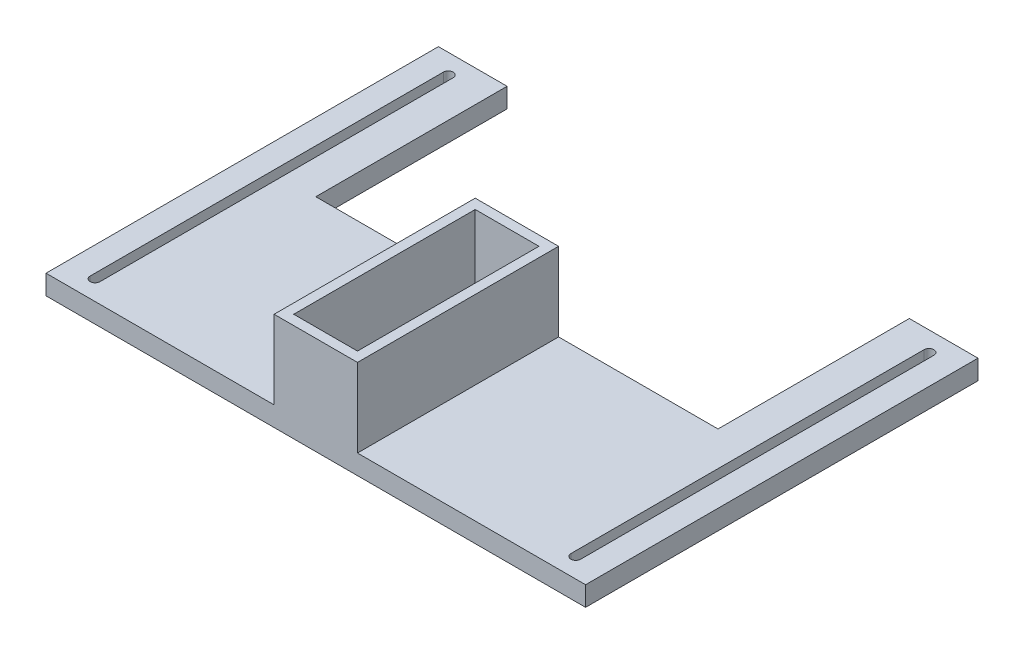
ISO-10303-21;
HEADER;
FILE_DESCRIPTION(('STEP AP214'),'2;1');
FILE_NAME('part.step','',(''),(''),'','','');
FILE_SCHEMA(('AUTOMOTIVE_DESIGN { 1 0 10303 214 1 1 1 1 }'));
ENDSEC;
DATA;
#1=APPLICATION_CONTEXT('core data for automotive mechanical design processes');
#2=APPLICATION_PROTOCOL_DEFINITION('international standard','automotive_design',2000,#1);
#3=PRODUCT_CONTEXT('',#1,'mechanical');
#4=PRODUCT('Part','Part','',(#3));
#5=PRODUCT_RELATED_PRODUCT_CATEGORY('part','',(#4));
#6=PRODUCT_DEFINITION_FORMATION('','',#4);
#7=PRODUCT_DEFINITION_CONTEXT('part definition',#1,'design');
#8=PRODUCT_DEFINITION('design','',#6,#7);
#9=PRODUCT_DEFINITION_SHAPE('','',#8);
#10=(LENGTH_UNIT() NAMED_UNIT(*) SI_UNIT(.MILLI.,.METRE.));
#11=(NAMED_UNIT(*) PLANE_ANGLE_UNIT() SI_UNIT($,.RADIAN.));
#12=(NAMED_UNIT(*) SI_UNIT($,.STERADIAN.) SOLID_ANGLE_UNIT());
#13=UNCERTAINTY_MEASURE_WITH_UNIT(LENGTH_MEASURE(1.E-05),#10,'distance_accuracy_value','');
#14=(GEOMETRIC_REPRESENTATION_CONTEXT(3) GLOBAL_UNCERTAINTY_ASSIGNED_CONTEXT((#13)) GLOBAL_UNIT_ASSIGNED_CONTEXT((#10,
#11,#12)) REPRESENTATION_CONTEXT('',''));
#15=CARTESIAN_POINT('',(0.,0.,0.));
#16=DIRECTION('',(0.,0.,1.));
#17=DIRECTION('',(1.,0.,0.));
#18=AXIS2_PLACEMENT_3D('',#15,#16,#17);
#19=CARTESIAN_POINT('',(0.,0.,0.));
#20=DIRECTION('',(0.,1.,0.));
#21=DIRECTION('',(0.,0.,1.));
#22=AXIS2_PLACEMENT_3D('',#19,#20,#21);
#23=PLANE('',#22);
#24=DIRECTION('',(0.,0.,-1.));
#25=VECTOR('',#24,1.);
#26=CARTESIAN_POINT('',(4.25,0.,0.));
#27=LINE('',#26,#25);
#28=CARTESIAN_POINT('',(4.25,0.,10.25));
#29=VERTEX_POINT('',#28);
#30=CARTESIAN_POINT('',(4.25000000000001,0.,-10.25));
#31=VERTEX_POINT('',#30);
#32=EDGE_CURVE('E382',#29,#31,#27,.T.);
#33=ORIENTED_EDGE('',*,*,#32,.F.);
#34=DIRECTION('',(-1.,0.,0.));
#35=VECTOR('',#34,1.);
#36=CARTESIAN_POINT('',(-27.5,0.,10.25));
#37=LINE('',#36,#35);
#38=CARTESIAN_POINT('',(27.5,0.,10.25));
#39=VERTEX_POINT('',#38);
#40=EDGE_CURVE('E325',#39,#29,#37,.T.);
#41=ORIENTED_EDGE('',*,*,#40,.F.);
#42=DIRECTION('',(0.,0.,1.));
#43=VECTOR('',#42,1.);
#44=CARTESIAN_POINT('',(27.5,0.,10.25));
#45=LINE('',#44,#43);
#46=CARTESIAN_POINT('',(27.5,0.,-29.75));
#47=VERTEX_POINT('',#46);
#48=EDGE_CURVE('E322',#47,#39,#45,.T.);
#49=ORIENTED_EDGE('',*,*,#48,.F.);
#50=DIRECTION('',(1.,0.,0.));
#51=VECTOR('',#50,1.);
#52=CARTESIAN_POINT('',(27.5,0.,-29.75));
#53=LINE('',#52,#51);
#54=CARTESIAN_POINT('',(20.5,0.,-29.75));
#55=VERTEX_POINT('',#54);
#56=EDGE_CURVE('E320',#55,#47,#53,.T.);
#57=ORIENTED_EDGE('',*,*,#56,.F.);
#58=DIRECTION('',(0.,0.,-1.));
#59=VECTOR('',#58,1.);
#60=CARTESIAN_POINT('',(20.5,0.,-29.75));
#61=LINE('',#60,#59);
#62=CARTESIAN_POINT('',(20.5,0.,-10.25));
#63=VERTEX_POINT('',#62);
#64=EDGE_CURVE('E318',#63,#55,#61,.T.);
#65=ORIENTED_EDGE('',*,*,#64,.F.);
#66=DIRECTION('',(1.,0.,0.));
#67=VECTOR('',#66,1.);
#68=CARTESIAN_POINT('',(20.5,0.,-10.25));
#69=LINE('',#68,#67);
#70=EDGE_CURVE('E314',#31,#63,#69,.T.);
#71=ORIENTED_EDGE('',*,*,#70,.F.);
#72=EDGE_LOOP('',(#33,#41,#49,#57,#65,#71));
#73=FACE_BOUND('',#72,.T.);
#74=DIRECTION('',(0.,0.,-1.));
#75=VECTOR('',#74,1.);
#76=CARTESIAN_POINT('',(25.,0.,8.24999999999999));
#77=LINE('',#76,#75);
#78=CARTESIAN_POINT('',(25.,0.,8.24999999999999));
#79=VERTEX_POINT('',#78);
#80=CARTESIAN_POINT('',(25.,0.,-27.75));
#81=VERTEX_POINT('',#80);
#82=EDGE_CURVE('E242',#79,#81,#77,.T.);
#83=ORIENTED_EDGE('',*,*,#82,.F.);
#84=CARTESIAN_POINT('',(24.5,0.,8.24999999999999));
#85=DIRECTION('',(0.,1.,0.));
#86=DIRECTION('',(0.,0.,1.));
#87=AXIS2_PLACEMENT_3D('',#84,#85,#86);
#88=CIRCLE('',#87,0.500000000000002);
#89=CARTESIAN_POINT('',(24.,0.,8.24999999999999));
#90=VERTEX_POINT('',#89);
#91=EDGE_CURVE('E226',#90,#79,#88,.T.);
#92=ORIENTED_EDGE('',*,*,#91,.F.);
#93=DIRECTION('',(0.,0.,1.));
#94=VECTOR('',#93,1.);
#95=CARTESIAN_POINT('',(24.,0.,8.24999999999999));
#96=LINE('',#95,#94);
#97=CARTESIAN_POINT('',(24.,0.,-27.75));
#98=VERTEX_POINT('',#97);
#99=EDGE_CURVE('E235',#98,#90,#96,.T.);
#100=ORIENTED_EDGE('',*,*,#99,.F.);
#101=CARTESIAN_POINT('',(24.5,0.,-27.75));
#102=DIRECTION('',(0.,1.,0.));
#103=DIRECTION('',(0.,0.,1.));
#104=AXIS2_PLACEMENT_3D('',#101,#102,#103);
#105=CIRCLE('',#104,0.5);
#106=EDGE_CURVE('E78',#81,#98,#105,.T.);
#107=ORIENTED_EDGE('',*,*,#106,.F.);
#108=EDGE_LOOP('',(#83,#92,#100,#107));
#109=FACE_BOUND('',#108,.T.);
#110=ADVANCED_FACE('F63',(#73,#109),#23,.T.);
#111=CARTESIAN_POINT('',(0.,-2.,0.));
#112=DIRECTION('',(0.,1.,0.));
#113=DIRECTION('',(0.,0.,1.));
#114=AXIS2_PLACEMENT_3D('',#111,#112,#113);
#115=PLANE('',#114);
#116=DIRECTION('',(1.,0.,0.));
#117=VECTOR('',#116,1.);
#118=CARTESIAN_POINT('',(-20.5,-2.,-29.75));
#119=LINE('',#118,#117);
#120=CARTESIAN_POINT('',(-27.5,-2.,-29.75));
#121=VERTEX_POINT('',#120);
#122=CARTESIAN_POINT('',(-20.5,-2.,-29.75));
#123=VERTEX_POINT('',#122);
#124=EDGE_CURVE('E291',#121,#123,#119,.T.);
#125=ORIENTED_EDGE('',*,*,#124,.T.);
#126=DIRECTION('',(0.,0.,1.));
#127=VECTOR('',#126,1.);
#128=CARTESIAN_POINT('',(-20.5,-2.,-10.25));
#129=LINE('',#128,#127);
#130=CARTESIAN_POINT('',(-20.5,-2.,-10.25));
#131=VERTEX_POINT('',#130);
#132=EDGE_CURVE('E294',#123,#131,#129,.T.);
#133=ORIENTED_EDGE('',*,*,#132,.T.);
#134=DIRECTION('',(1.,0.,0.));
#135=VECTOR('',#134,1.);
#136=CARTESIAN_POINT('',(20.5,-2.,-10.25));
#137=LINE('',#136,#135);
#138=CARTESIAN_POINT('',(20.5,-2.,-10.25));
#139=VERTEX_POINT('',#138);
#140=EDGE_CURVE('E297',#131,#139,#137,.T.);
#141=ORIENTED_EDGE('',*,*,#140,.T.);
#142=DIRECTION('',(0.,0.,-1.));
#143=VECTOR('',#142,1.);
#144=CARTESIAN_POINT('',(20.5,-2.,-29.75));
#145=LINE('',#144,#143);
#146=CARTESIAN_POINT('',(20.5,-2.,-29.75));
#147=VERTEX_POINT('',#146);
#148=EDGE_CURVE('E299',#139,#147,#145,.T.);
#149=ORIENTED_EDGE('',*,*,#148,.T.);
#150=DIRECTION('',(1.,0.,0.));
#151=VECTOR('',#150,1.);
#152=CARTESIAN_POINT('',(27.5,-2.,-29.75));
#153=LINE('',#152,#151);
#154=CARTESIAN_POINT('',(27.5,-2.,-29.75));
#155=VERTEX_POINT('',#154);
#156=EDGE_CURVE('E301',#147,#155,#153,.T.);
#157=ORIENTED_EDGE('',*,*,#156,.T.);
#158=DIRECTION('',(0.,0.,1.));
#159=VECTOR('',#158,1.);
#160=CARTESIAN_POINT('',(27.5,-2.,10.25));
#161=LINE('',#160,#159);
#162=CARTESIAN_POINT('',(27.5,-2.,10.25));
#163=VERTEX_POINT('',#162);
#164=EDGE_CURVE('E303',#155,#163,#161,.T.);
#165=ORIENTED_EDGE('',*,*,#164,.T.);
#166=DIRECTION('',(-1.,0.,0.));
#167=VECTOR('',#166,1.);
#168=CARTESIAN_POINT('',(-27.5,-2.,10.25));
#169=LINE('',#168,#167);
#170=CARTESIAN_POINT('',(-27.5,-2.,10.25));
#171=VERTEX_POINT('',#170);
#172=EDGE_CURVE('E305',#163,#171,#169,.T.);
#173=ORIENTED_EDGE('',*,*,#172,.T.);
#174=DIRECTION('',(0.,0.,-1.));
#175=VECTOR('',#174,1.);
#176=CARTESIAN_POINT('',(-27.5,-2.,-29.75));
#177=LINE('',#176,#175);
#178=EDGE_CURVE('E307',#171,#121,#177,.T.);
#179=ORIENTED_EDGE('',*,*,#178,.T.);
#180=EDGE_LOOP('',(#125,#133,#141,#149,#157,#165,#173,#179));
#181=FACE_BOUND('',#180,.T.);
#182=DIRECTION('',(0.,0.,-1.));
#183=VECTOR('',#182,1.);
#184=CARTESIAN_POINT('',(-25.,-2.,8.24999999999999));
#185=LINE('',#184,#183);
#186=CARTESIAN_POINT('',(-25.,-2.,8.24999999999999));
#187=VERTEX_POINT('',#186);
#188=CARTESIAN_POINT('',(-25.,-2.,-27.75));
#189=VERTEX_POINT('',#188);
#190=EDGE_CURVE('E269',#187,#189,#185,.T.);
#191=ORIENTED_EDGE('',*,*,#190,.F.);
#192=CARTESIAN_POINT('',(-24.5,-2.,8.24999999999999));
#193=DIRECTION('',(0.,-1.,0.));
#194=DIRECTION('',(0.,0.,-1.));
#195=AXIS2_PLACEMENT_3D('',#192,#193,#194);
#196=CIRCLE('',#195,0.500000000000002);
#197=CARTESIAN_POINT('',(-24.,-2.,8.24999999999999));
#198=VERTEX_POINT('',#197);
#199=EDGE_CURVE('E267',#198,#187,#196,.T.);
#200=ORIENTED_EDGE('',*,*,#199,.F.);
#201=DIRECTION('',(0.,0.,1.));
#202=VECTOR('',#201,1.);
#203=CARTESIAN_POINT('',(-24.,-2.,8.24999999999999));
#204=LINE('',#203,#202);
#205=CARTESIAN_POINT('',(-24.,-2.,-27.75));
#206=VERTEX_POINT('',#205);
#207=EDGE_CURVE('E275',#206,#198,#204,.T.);
#208=ORIENTED_EDGE('',*,*,#207,.F.);
#209=CARTESIAN_POINT('',(-24.5,-2.,-27.75));
#210=DIRECTION('',(0.,-1.,0.));
#211=DIRECTION('',(0.,0.,-1.));
#212=AXIS2_PLACEMENT_3D('',#209,#210,#211);
#213=CIRCLE('',#212,0.5);
#214=EDGE_CURVE('E272',#189,#206,#213,.T.);
#215=ORIENTED_EDGE('',*,*,#214,.F.);
#216=EDGE_LOOP('',(#191,#200,#208,#215));
#217=FACE_BOUND('',#216,.T.);
#218=CARTESIAN_POINT('',(24.5,-2.,8.24999999999999));
#219=DIRECTION('',(0.,1.,0.));
#220=DIRECTION('',(0.,0.,-1.));
#221=AXIS2_PLACEMENT_3D('',#218,#219,#220);
#222=CIRCLE('',#221,0.500000000000002);
#223=CARTESIAN_POINT('',(24.,-2.,8.24999999999999));
#224=VERTEX_POINT('',#223);
#225=CARTESIAN_POINT('',(25.,-2.,8.24999999999999));
#226=VERTEX_POINT('',#225);
#227=EDGE_CURVE('E86',#224,#226,#222,.T.);
#228=ORIENTED_EDGE('',*,*,#227,.T.);
#229=DIRECTION('',(0.,0.,-1.));
#230=VECTOR('',#229,1.);
#231=CARTESIAN_POINT('',(25.,-2.,8.24999999999999));
#232=LINE('',#231,#230);
#233=CARTESIAN_POINT('',(25.,-2.,-27.75));
#234=VERTEX_POINT('',#233);
#235=EDGE_CURVE('E232',#226,#234,#232,.T.);
#236=ORIENTED_EDGE('',*,*,#235,.T.);
#237=CARTESIAN_POINT('',(24.5,-2.,-27.75));
#238=DIRECTION('',(0.,1.,0.));
#239=DIRECTION('',(0.,0.,-1.));
#240=AXIS2_PLACEMENT_3D('',#237,#238,#239);
#241=CIRCLE('',#240,0.5);
#242=CARTESIAN_POINT('',(24.,-2.,-27.75));
#243=VERTEX_POINT('',#242);
#244=EDGE_CURVE('E250',#234,#243,#241,.T.);
#245=ORIENTED_EDGE('',*,*,#244,.T.);
#246=DIRECTION('',(0.,0.,1.));
#247=VECTOR('',#246,1.);
#248=CARTESIAN_POINT('',(24.,-2.,8.24999999999999));
#249=LINE('',#248,#247);
#250=EDGE_CURVE('E244',#243,#224,#249,.T.);
#251=ORIENTED_EDGE('',*,*,#250,.T.);
#252=EDGE_LOOP('',(#228,#236,#245,#251));
#253=FACE_BOUND('',#252,.T.);
#254=ADVANCED_FACE('F428',(#181,#217,#253),#115,.F.);
#255=CARTESIAN_POINT('',(0.,8.,0.));
#256=DIRECTION('',(0.,1.,0.));
#257=DIRECTION('',(0.,0.,1.));
#258=AXIS2_PLACEMENT_3D('',#255,#256,#257);
#259=PLANE('',#258);
#260=DIRECTION('',(0.,0.,-1.));
#261=VECTOR('',#260,1.);
#262=CARTESIAN_POINT('',(4.25,8.,0.));
#263=LINE('',#262,#261);
#264=CARTESIAN_POINT('',(4.25,8.,10.25));
#265=VERTEX_POINT('',#264);
#266=CARTESIAN_POINT('',(4.25,8.,-10.25));
#267=VERTEX_POINT('',#266);
#268=EDGE_CURVE('E383',#265,#267,#263,.T.);
#269=ORIENTED_EDGE('',*,*,#268,.T.);
#270=DIRECTION('',(-1.,0.,0.));
#271=VECTOR('',#270,1.);
#272=CARTESIAN_POINT('',(0.,8.,-10.25));
#273=LINE('',#272,#271);
#274=CARTESIAN_POINT('',(-4.25,8.,-10.25));
#275=VERTEX_POINT('',#274);
#276=EDGE_CURVE('E386',#267,#275,#273,.T.);
#277=ORIENTED_EDGE('',*,*,#276,.T.);
#278=DIRECTION('',(0.,0.,1.));
#279=VECTOR('',#278,1.);
#280=CARTESIAN_POINT('',(-4.25,8.,0.));
#281=LINE('',#280,#279);
#282=CARTESIAN_POINT('',(-4.25,8.,10.25));
#283=VERTEX_POINT('',#282);
#284=EDGE_CURVE('E389',#275,#283,#281,.T.);
#285=ORIENTED_EDGE('',*,*,#284,.T.);
#286=DIRECTION('',(1.,0.,0.));
#287=VECTOR('',#286,1.);
#288=CARTESIAN_POINT('',(0.,8.,10.25));
#289=LINE('',#288,#287);
#290=EDGE_CURVE('E391',#283,#265,#289,.T.);
#291=ORIENTED_EDGE('',*,*,#290,.T.);
#292=EDGE_LOOP('',(#269,#277,#285,#291));
#293=FACE_BOUND('',#292,.T.);
#294=DIRECTION('',(-1.,0.,0.));
#295=VECTOR('',#294,1.);
#296=CARTESIAN_POINT('',(-3.25,8.,-9.25));
#297=LINE('',#296,#295);
#298=CARTESIAN_POINT('',(3.25,8.,-9.25));
#299=VERTEX_POINT('',#298);
#300=CARTESIAN_POINT('',(-3.25,8.,-9.25));
#301=VERTEX_POINT('',#300);
#302=EDGE_CURVE('E355',#299,#301,#297,.T.);
#303=ORIENTED_EDGE('',*,*,#302,.F.);
#304=DIRECTION('',(0.,0.,-1.));
#305=VECTOR('',#304,1.);
#306=CARTESIAN_POINT('',(3.25,8.,9.25));
#307=LINE('',#306,#305);
#308=CARTESIAN_POINT('',(3.25,8.,9.25));
#309=VERTEX_POINT('',#308);
#310=EDGE_CURVE('E353',#309,#299,#307,.T.);
#311=ORIENTED_EDGE('',*,*,#310,.F.);
#312=DIRECTION('',(1.,0.,0.));
#313=VECTOR('',#312,1.);
#314=CARTESIAN_POINT('',(-3.25,8.,9.25));
#315=LINE('',#314,#313);
#316=CARTESIAN_POINT('',(-3.25,8.,9.25));
#317=VERTEX_POINT('',#316);
#318=EDGE_CURVE('E361',#317,#309,#315,.T.);
#319=ORIENTED_EDGE('',*,*,#318,.F.);
#320=DIRECTION('',(0.,0.,1.));
#321=VECTOR('',#320,1.);
#322=CARTESIAN_POINT('',(-3.25,8.,9.25));
#323=LINE('',#322,#321);
#324=EDGE_CURVE('E358',#301,#317,#323,.T.);
#325=ORIENTED_EDGE('',*,*,#324,.F.);
#326=EDGE_LOOP('',(#303,#311,#319,#325));
#327=FACE_BOUND('',#326,.T.);
#328=ADVANCED_FACE('F444',(#293,#327),#259,.T.);
#329=CARTESIAN_POINT('',(4.25,8.,0.));
#330=DIRECTION('',(-1.,0.,0.));
#331=DIRECTION('',(0.,0.,1.));
#332=AXIS2_PLACEMENT_3D('',#329,#330,#331);
#333=PLANE('',#332);
#334=ORIENTED_EDGE('',*,*,#32,.T.);
#335=DIRECTION('',(0.,-1.,0.));
#336=VECTOR('',#335,1.);
#337=CARTESIAN_POINT('',(4.25,8.,-10.25));
#338=LINE('',#337,#336);
#339=EDGE_CURVE('E12',#267,#31,#338,.T.);
#340=ORIENTED_EDGE('',*,*,#339,.F.);
#341=ORIENTED_EDGE('',*,*,#268,.F.);
#342=DIRECTION('',(0.,-1.,0.));
#343=VECTOR('',#342,1.);
#344=CARTESIAN_POINT('',(4.25,8.,10.25));
#345=LINE('',#344,#343);
#346=EDGE_CURVE('E393',#265,#29,#345,.T.);
#347=ORIENTED_EDGE('',*,*,#346,.T.);
#348=EDGE_LOOP('',(#334,#340,#341,#347));
#349=FACE_BOUND('',#348,.T.);
#350=ADVANCED_FACE('F65',(#349),#333,.F.);
#351=CARTESIAN_POINT('',(0.,8.,-10.25));
#352=DIRECTION('',(0.,0.,1.));
#353=DIRECTION('',(1.,0.,0.));
#354=AXIS2_PLACEMENT_3D('',#351,#352,#353);
#355=PLANE('',#354);
#356=ORIENTED_EDGE('',*,*,#339,.T.);
#357=ORIENTED_EDGE('',*,*,#70,.T.);
#358=DIRECTION('',(0.,1.,0.));
#359=VECTOR('',#358,1.);
#360=CARTESIAN_POINT('',(20.5,-2.,-10.25));
#361=LINE('',#360,#359);
#362=EDGE_CURVE('E343',#139,#63,#361,.T.);
#363=ORIENTED_EDGE('',*,*,#362,.F.);
#364=ORIENTED_EDGE('',*,*,#140,.F.);
#365=DIRECTION('',(0.,1.,0.));
#366=VECTOR('',#365,1.);
#367=CARTESIAN_POINT('',(-20.5,-2.,-10.25));
#368=LINE('',#367,#366);
#369=CARTESIAN_POINT('',(-20.5,0.,-10.25));
#370=VERTEX_POINT('',#369);
#371=EDGE_CURVE('E346',#131,#370,#368,.T.);
#372=ORIENTED_EDGE('',*,*,#371,.T.);
#373=CARTESIAN_POINT('',(-4.24999999999999,0.,-10.25));
#374=VERTEX_POINT('',#373);
#375=EDGE_CURVE('E315',#370,#374,#69,.T.);
#376=ORIENTED_EDGE('',*,*,#375,.T.);
#377=DIRECTION('',(0.,-1.,0.));
#378=VECTOR('',#377,1.);
#379=CARTESIAN_POINT('',(-4.25,8.,-10.25));
#380=LINE('',#379,#378);
#381=EDGE_CURVE('E71',#275,#374,#380,.T.);
#382=ORIENTED_EDGE('',*,*,#381,.F.);
#383=ORIENTED_EDGE('',*,*,#276,.F.);
#384=EDGE_LOOP('',(#356,#357,#363,#364,#372,#376,#382,#383));
#385=FACE_BOUND('',#384,.T.);
#386=ADVANCED_FACE('F409',(#385),#355,.F.);
#387=CARTESIAN_POINT('',(-4.25,8.,0.));
#388=DIRECTION('',(1.,0.,0.));
#389=DIRECTION('',(0.,0.,-1.));
#390=AXIS2_PLACEMENT_3D('',#387,#388,#389);
#391=PLANE('',#390);
#392=DIRECTION('',(0.,0.,1.));
#393=VECTOR('',#392,1.);
#394=CARTESIAN_POINT('',(-4.25,0.,0.));
#395=LINE('',#394,#393);
#396=CARTESIAN_POINT('',(-4.25,0.,10.25));
#397=VERTEX_POINT('',#396);
#398=EDGE_CURVE('E387',#374,#397,#395,.T.);
#399=ORIENTED_EDGE('',*,*,#398,.T.);
#400=DIRECTION('',(0.,-1.,0.));
#401=VECTOR('',#400,1.);
#402=CARTESIAN_POINT('',(-4.25,8.,10.25));
#403=LINE('',#402,#401);
#404=EDGE_CURVE('E400',#283,#397,#403,.T.);
#405=ORIENTED_EDGE('',*,*,#404,.F.);
#406=ORIENTED_EDGE('',*,*,#284,.F.);
#407=ORIENTED_EDGE('',*,*,#381,.T.);
#408=EDGE_LOOP('',(#399,#405,#406,#407));
#409=FACE_BOUND('',#408,.T.);
#410=ADVANCED_FACE('F406',(#409),#391,.F.);
#411=CARTESIAN_POINT('',(0.,8.,10.25));
#412=DIRECTION('',(0.,0.,-1.));
#413=DIRECTION('',(-1.,0.,0.));
#414=AXIS2_PLACEMENT_3D('',#411,#412,#413);
#415=PLANE('',#414);
#416=ORIENTED_EDGE('',*,*,#404,.T.);
#417=CARTESIAN_POINT('',(-27.5,0.,10.25));
#418=VERTEX_POINT('',#417);
#419=EDGE_CURVE('E324',#397,#418,#37,.T.);
#420=ORIENTED_EDGE('',*,*,#419,.T.);
#421=DIRECTION('',(0.,1.,0.));
#422=VECTOR('',#421,1.);
#423=CARTESIAN_POINT('',(-27.5,-2.,10.25));
#424=LINE('',#423,#422);
#425=EDGE_CURVE('E331',#171,#418,#424,.T.);
#426=ORIENTED_EDGE('',*,*,#425,.F.);
#427=ORIENTED_EDGE('',*,*,#172,.F.);
#428=DIRECTION('',(0.,1.,0.));
#429=VECTOR('',#428,1.);
#430=CARTESIAN_POINT('',(27.5,-2.,10.25));
#431=LINE('',#430,#429);
#432=EDGE_CURVE('E334',#163,#39,#431,.T.);
#433=ORIENTED_EDGE('',*,*,#432,.T.);
#434=ORIENTED_EDGE('',*,*,#40,.T.);
#435=ORIENTED_EDGE('',*,*,#346,.F.);
#436=ORIENTED_EDGE('',*,*,#290,.F.);
#437=EDGE_LOOP('',(#416,#420,#426,#427,#433,#434,#435,#436));
#438=FACE_BOUND('',#437,.T.);
#439=ADVANCED_FACE('F419',(#438),#415,.F.);
#440=CARTESIAN_POINT('',(3.25,8.,9.25));
#441=DIRECTION('',(-1.,0.,0.));
#442=DIRECTION('',(0.,0.,1.));
#443=AXIS2_PLACEMENT_3D('',#440,#441,#442);
#444=PLANE('',#443);
#445=DIRECTION('',(0.,0.,-1.));
#446=VECTOR('',#445,1.);
#447=CARTESIAN_POINT('',(3.25,0.,9.25));
#448=LINE('',#447,#446);
#449=CARTESIAN_POINT('',(3.25,0.,9.25));
#450=VERTEX_POINT('',#449);
#451=CARTESIAN_POINT('',(3.25,0.,-9.25));
#452=VERTEX_POINT('',#451);
#453=EDGE_CURVE('E352',#450,#452,#448,.T.);
#454=ORIENTED_EDGE('',*,*,#453,.F.);
#455=DIRECTION('',(0.,-1.,0.));
#456=VECTOR('',#455,1.);
#457=CARTESIAN_POINT('',(3.25,8.,9.25));
#458=LINE('',#457,#456);
#459=EDGE_CURVE('E363',#309,#450,#458,.T.);
#460=ORIENTED_EDGE('',*,*,#459,.F.);
#461=ORIENTED_EDGE('',*,*,#310,.T.);
#462=DIRECTION('',(0.,-1.,0.));
#463=VECTOR('',#462,1.);
#464=CARTESIAN_POINT('',(3.25,8.,-9.25));
#465=LINE('',#464,#463);
#466=EDGE_CURVE('E379',#299,#452,#465,.T.);
#467=ORIENTED_EDGE('',*,*,#466,.T.);
#468=EDGE_LOOP('',(#454,#460,#461,#467));
#469=FACE_BOUND('',#468,.T.);
#470=ADVANCED_FACE('F464',(#469),#444,.T.);
#471=CARTESIAN_POINT('',(-3.25,8.,-9.25));
#472=DIRECTION('',(0.,0.,1.));
#473=DIRECTION('',(1.,0.,0.));
#474=AXIS2_PLACEMENT_3D('',#471,#472,#473);
#475=PLANE('',#474);
#476=DIRECTION('',(-1.,0.,0.));
#477=VECTOR('',#476,1.);
#478=CARTESIAN_POINT('',(-3.25,0.,-9.25));
#479=LINE('',#478,#477);
#480=CARTESIAN_POINT('',(-3.25,0.,-9.25));
#481=VERTEX_POINT('',#480);
#482=EDGE_CURVE('E366',#452,#481,#479,.T.);
#483=ORIENTED_EDGE('',*,*,#482,.F.);
#484=ORIENTED_EDGE('',*,*,#466,.F.);
#485=ORIENTED_EDGE('',*,*,#302,.T.);
#486=DIRECTION('',(0.,-1.,0.));
#487=VECTOR('',#486,1.);
#488=CARTESIAN_POINT('',(-3.25,8.,-9.25));
#489=LINE('',#488,#487);
#490=EDGE_CURVE('E377',#301,#481,#489,.T.);
#491=ORIENTED_EDGE('',*,*,#490,.T.);
#492=EDGE_LOOP('',(#483,#484,#485,#491));
#493=FACE_BOUND('',#492,.T.);
#494=ADVANCED_FACE('F455',(#493),#475,.T.);
#495=CARTESIAN_POINT('',(-3.25,8.,9.25));
#496=DIRECTION('',(1.,0.,0.));
#497=DIRECTION('',(0.,0.,-1.));
#498=AXIS2_PLACEMENT_3D('',#495,#496,#497);
#499=PLANE('',#498);
#500=DIRECTION('',(0.,0.,1.));
#501=VECTOR('',#500,1.);
#502=CARTESIAN_POINT('',(-3.25,0.,9.25));
#503=LINE('',#502,#501);
#504=CARTESIAN_POINT('',(-3.25,0.,9.25));
#505=VERTEX_POINT('',#504);
#506=EDGE_CURVE('E369',#481,#505,#503,.T.);
#507=ORIENTED_EDGE('',*,*,#506,.F.);
#508=ORIENTED_EDGE('',*,*,#490,.F.);
#509=ORIENTED_EDGE('',*,*,#324,.T.);
#510=DIRECTION('',(0.,-1.,0.));
#511=VECTOR('',#510,1.);
#512=CARTESIAN_POINT('',(-3.25,8.,9.25));
#513=LINE('',#512,#511);
#514=EDGE_CURVE('E375',#317,#505,#513,.T.);
#515=ORIENTED_EDGE('',*,*,#514,.T.);
#516=EDGE_LOOP('',(#507,#508,#509,#515));
#517=FACE_BOUND('',#516,.T.);
#518=ADVANCED_FACE('F458',(#517),#499,.T.);
#519=CARTESIAN_POINT('',(-3.25,8.,9.25));
#520=DIRECTION('',(0.,0.,-1.));
#521=DIRECTION('',(-1.,0.,0.));
#522=AXIS2_PLACEMENT_3D('',#519,#520,#521);
#523=PLANE('',#522);
#524=DIRECTION('',(1.,0.,0.));
#525=VECTOR('',#524,1.);
#526=CARTESIAN_POINT('',(-3.25,0.,9.25));
#527=LINE('',#526,#525);
#528=EDGE_CURVE('E356',#505,#450,#527,.T.);
#529=ORIENTED_EDGE('',*,*,#528,.F.);
#530=ORIENTED_EDGE('',*,*,#514,.F.);
#531=ORIENTED_EDGE('',*,*,#318,.T.);
#532=ORIENTED_EDGE('',*,*,#459,.T.);
#533=EDGE_LOOP('',(#529,#530,#531,#532));
#534=FACE_BOUND('',#533,.T.);
#535=ADVANCED_FACE('F467',(#534),#523,.T.);
#536=ORIENTED_EDGE('',*,*,#528,.T.);
#537=ORIENTED_EDGE('',*,*,#453,.T.);
#538=ORIENTED_EDGE('',*,*,#482,.T.);
#539=ORIENTED_EDGE('',*,*,#506,.T.);
#540=EDGE_LOOP('',(#536,#537,#538,#539));
#541=FACE_BOUND('',#540,.T.);
#542=ADVANCED_FACE('F461',(#541),#23,.T.);
#543=CARTESIAN_POINT('',(-24.5,0.,8.24999999999999));
#544=DIRECTION('',(0.,1.,0.));
#545=DIRECTION('',(0.,0.,1.));
#546=AXIS2_PLACEMENT_3D('',#543,#544,#545);
#547=CIRCLE('',#546,0.500000000000002);
#548=CARTESIAN_POINT('',(-24.,0.,8.24999999999999));
#549=VERTEX_POINT('',#548);
#550=CARTESIAN_POINT('',(-25.,0.,8.24999999999999));
#551=VERTEX_POINT('',#550);
#552=EDGE_CURVE('E264',#549,#551,#547,.F.);
#553=ORIENTED_EDGE('',*,*,#552,.T.);
#554=DIRECTION('',(0.,0.,-1.));
#555=VECTOR('',#554,1.);
#556=CARTESIAN_POINT('',(-25.,0.,8.24999999999999));
#557=LINE('',#556,#555);
#558=CARTESIAN_POINT('',(-25.,0.,-27.75));
#559=VERTEX_POINT('',#558);
#560=EDGE_CURVE('E281',#551,#559,#557,.T.);
#561=ORIENTED_EDGE('',*,*,#560,.T.);
#562=CARTESIAN_POINT('',(-24.5,0.,-27.75));
#563=DIRECTION('',(0.,1.,0.));
#564=DIRECTION('',(0.,0.,1.));
#565=AXIS2_PLACEMENT_3D('',#562,#563,#564);
#566=CIRCLE('',#565,0.5);
#567=CARTESIAN_POINT('',(-24.,0.,-27.75));
#568=VERTEX_POINT('',#567);
#569=EDGE_CURVE('E238',#559,#568,#566,.F.);
#570=ORIENTED_EDGE('',*,*,#569,.T.);
#571=DIRECTION('',(0.,0.,1.));
#572=VECTOR('',#571,1.);
#573=CARTESIAN_POINT('',(-24.,0.,8.24999999999999));
#574=LINE('',#573,#572);
#575=EDGE_CURVE('E261',#568,#549,#574,.T.);
#576=ORIENTED_EDGE('',*,*,#575,.T.);
#577=EDGE_LOOP('',(#553,#561,#570,#576));
#578=FACE_BOUND('',#577,.T.);
#579=ORIENTED_EDGE('',*,*,#398,.F.);
#580=ORIENTED_EDGE('',*,*,#375,.F.);
#581=DIRECTION('',(0.,0.,1.));
#582=VECTOR('',#581,1.);
#583=CARTESIAN_POINT('',(-20.5,0.,-10.25));
#584=LINE('',#583,#582);
#585=CARTESIAN_POINT('',(-20.5,0.,-29.75));
#586=VERTEX_POINT('',#585);
#587=EDGE_CURVE('E312',#586,#370,#584,.T.);
#588=ORIENTED_EDGE('',*,*,#587,.F.);
#589=DIRECTION('',(1.,0.,0.));
#590=VECTOR('',#589,1.);
#591=CARTESIAN_POINT('',(-20.5,0.,-29.75));
#592=LINE('',#591,#590);
#593=CARTESIAN_POINT('',(-27.5,0.,-29.75));
#594=VERTEX_POINT('',#593);
#595=EDGE_CURVE('E290',#594,#586,#592,.T.);
#596=ORIENTED_EDGE('',*,*,#595,.F.);
#597=DIRECTION('',(0.,0.,-1.));
#598=VECTOR('',#597,1.);
#599=CARTESIAN_POINT('',(-27.5,0.,-29.75));
#600=LINE('',#599,#598);
#601=EDGE_CURVE('E295',#418,#594,#600,.T.);
#602=ORIENTED_EDGE('',*,*,#601,.F.);
#603=ORIENTED_EDGE('',*,*,#419,.F.);
#604=EDGE_LOOP('',(#579,#580,#588,#596,#602,#603));
#605=FACE_BOUND('',#604,.T.);
#606=ADVANCED_FACE('F414',(#578,#605),#23,.T.);
#607=CARTESIAN_POINT('',(-20.5,-2.,-29.75));
#608=DIRECTION('',(0.,0.,1.));
#609=DIRECTION('',(1.,0.,0.));
#610=AXIS2_PLACEMENT_3D('',#607,#608,#609);
#611=PLANE('',#610);
#612=ORIENTED_EDGE('',*,*,#595,.T.);
#613=DIRECTION('',(0.,1.,0.));
#614=VECTOR('',#613,1.);
#615=CARTESIAN_POINT('',(-20.5,-2.,-29.75));
#616=LINE('',#615,#614);
#617=EDGE_CURVE('E349',#123,#586,#616,.T.);
#618=ORIENTED_EDGE('',*,*,#617,.F.);
#619=ORIENTED_EDGE('',*,*,#124,.F.);
#620=DIRECTION('',(0.,1.,0.));
#621=VECTOR('',#620,1.);
#622=CARTESIAN_POINT('',(-27.5,-2.,-29.75));
#623=LINE('',#622,#621);
#624=EDGE_CURVE('E309',#121,#594,#623,.T.);
#625=ORIENTED_EDGE('',*,*,#624,.T.);
#626=EDGE_LOOP('',(#612,#618,#619,#625));
#627=FACE_BOUND('',#626,.T.);
#628=ADVANCED_FACE('F485',(#627),#611,.F.);
#629=CARTESIAN_POINT('',(-20.5,-2.,-10.25));
#630=DIRECTION('',(-1.,0.,0.));
#631=DIRECTION('',(0.,0.,1.));
#632=AXIS2_PLACEMENT_3D('',#629,#630,#631);
#633=PLANE('',#632);
#634=ORIENTED_EDGE('',*,*,#587,.T.);
#635=ORIENTED_EDGE('',*,*,#371,.F.);
#636=ORIENTED_EDGE('',*,*,#132,.F.);
#637=ORIENTED_EDGE('',*,*,#617,.T.);
#638=EDGE_LOOP('',(#634,#635,#636,#637));
#639=FACE_BOUND('',#638,.T.);
#640=ADVANCED_FACE('F492',(#639),#633,.F.);
#641=CARTESIAN_POINT('',(20.5,-2.,-29.75));
#642=DIRECTION('',(1.,0.,0.));
#643=DIRECTION('',(0.,0.,-1.));
#644=AXIS2_PLACEMENT_3D('',#641,#642,#643);
#645=PLANE('',#644);
#646=ORIENTED_EDGE('',*,*,#64,.T.);
#647=DIRECTION('',(0.,1.,0.));
#648=VECTOR('',#647,1.);
#649=CARTESIAN_POINT('',(20.5,-2.,-29.75));
#650=LINE('',#649,#648);
#651=EDGE_CURVE('E340',#147,#55,#650,.T.);
#652=ORIENTED_EDGE('',*,*,#651,.F.);
#653=ORIENTED_EDGE('',*,*,#148,.F.);
#654=ORIENTED_EDGE('',*,*,#362,.T.);
#655=EDGE_LOOP('',(#646,#652,#653,#654));
#656=FACE_BOUND('',#655,.T.);
#657=ADVANCED_FACE('F531',(#656),#645,.F.);
#658=CARTESIAN_POINT('',(27.5,-2.,-29.75));
#659=DIRECTION('',(0.,0.,1.));
#660=DIRECTION('',(1.,0.,0.));
#661=AXIS2_PLACEMENT_3D('',#658,#659,#660);
#662=PLANE('',#661);
#663=ORIENTED_EDGE('',*,*,#56,.T.);
#664=DIRECTION('',(0.,1.,0.));
#665=VECTOR('',#664,1.);
#666=CARTESIAN_POINT('',(27.5,-2.,-29.75));
#667=LINE('',#666,#665);
#668=EDGE_CURVE('E337',#155,#47,#667,.T.);
#669=ORIENTED_EDGE('',*,*,#668,.F.);
#670=ORIENTED_EDGE('',*,*,#156,.F.);
#671=ORIENTED_EDGE('',*,*,#651,.T.);
#672=EDGE_LOOP('',(#663,#669,#670,#671));
#673=FACE_BOUND('',#672,.T.);
#674=ADVANCED_FACE('F526',(#673),#662,.F.);
#675=CARTESIAN_POINT('',(27.5,-2.,10.25));
#676=DIRECTION('',(-1.,0.,0.));
#677=DIRECTION('',(0.,0.,1.));
#678=AXIS2_PLACEMENT_3D('',#675,#676,#677);
#679=PLANE('',#678);
#680=ORIENTED_EDGE('',*,*,#48,.T.);
#681=ORIENTED_EDGE('',*,*,#432,.F.);
#682=ORIENTED_EDGE('',*,*,#164,.F.);
#683=ORIENTED_EDGE('',*,*,#668,.T.);
#684=EDGE_LOOP('',(#680,#681,#682,#683));
#685=FACE_BOUND('',#684,.T.);
#686=ADVANCED_FACE('F522',(#685),#679,.F.);
#687=CARTESIAN_POINT('',(-27.5,-2.,-29.75));
#688=DIRECTION('',(1.,0.,0.));
#689=DIRECTION('',(0.,0.,-1.));
#690=AXIS2_PLACEMENT_3D('',#687,#688,#689);
#691=PLANE('',#690);
#692=ORIENTED_EDGE('',*,*,#601,.T.);
#693=ORIENTED_EDGE('',*,*,#624,.F.);
#694=ORIENTED_EDGE('',*,*,#178,.F.);
#695=ORIENTED_EDGE('',*,*,#425,.T.);
#696=EDGE_LOOP('',(#692,#693,#694,#695));
#697=FACE_BOUND('',#696,.T.);
#698=ADVANCED_FACE('F424',(#697),#691,.F.);
#699=CARTESIAN_POINT('',(-24.5,8.001,8.24999999999999));
#700=DIRECTION('',(0.,-1.,0.));
#701=DIRECTION('',(0.,0.,-1.));
#702=AXIS2_PLACEMENT_3D('',#699,#700,#701);
#703=CYLINDRICAL_SURFACE('',#702,0.500000000000002);
#704=DIRECTION('',(0.,-1.,0.));
#705=VECTOR('',#704,1.);
#706=CARTESIAN_POINT('',(-24.,8.001,8.24999999999999));
#707=LINE('',#706,#705);
#708=EDGE_CURVE('E279',#549,#198,#707,.T.);
#709=ORIENTED_EDGE('',*,*,#708,.T.);
#710=ORIENTED_EDGE('',*,*,#199,.T.);
#711=DIRECTION('',(0.,-1.,0.));
#712=VECTOR('',#711,1.);
#713=CARTESIAN_POINT('',(-25.,8.001,8.24999999999999));
#714=LINE('',#713,#712);
#715=EDGE_CURVE('E278',#551,#187,#714,.T.);
#716=ORIENTED_EDGE('',*,*,#715,.F.);
#717=ORIENTED_EDGE('',*,*,#552,.F.);
#718=EDGE_LOOP('',(#709,#710,#716,#717));
#719=FACE_BOUND('',#718,.T.);
#720=ADVANCED_FACE('F497',(#719),#703,.F.);
#721=CARTESIAN_POINT('',(-24.,8.001,8.24999999999999));
#722=DIRECTION('',(1.,0.,0.));
#723=DIRECTION('',(0.,0.,-1.));
#724=AXIS2_PLACEMENT_3D('',#721,#722,#723);
#725=PLANE('',#724);
#726=DIRECTION('',(0.,-1.,0.));
#727=VECTOR('',#726,1.);
#728=CARTESIAN_POINT('',(-24.,8.001,-27.75));
#729=LINE('',#728,#727);
#730=EDGE_CURVE('E282',#568,#206,#729,.T.);
#731=ORIENTED_EDGE('',*,*,#730,.T.);
#732=ORIENTED_EDGE('',*,*,#207,.T.);
#733=ORIENTED_EDGE('',*,*,#708,.F.);
#734=ORIENTED_EDGE('',*,*,#575,.F.);
#735=EDGE_LOOP('',(#731,#732,#733,#734));
#736=FACE_BOUND('',#735,.T.);
#737=ADVANCED_FACE('F499',(#736),#725,.F.);
#738=CARTESIAN_POINT('',(-24.5,8.001,-27.75));
#739=DIRECTION('',(0.,-1.,0.));
#740=DIRECTION('',(0.,0.,-1.));
#741=AXIS2_PLACEMENT_3D('',#738,#739,#740);
#742=CYLINDRICAL_SURFACE('',#741,0.5);
#743=DIRECTION('',(0.,-1.,0.));
#744=VECTOR('',#743,1.);
#745=CARTESIAN_POINT('',(-25.,8.001,-27.75));
#746=LINE('',#745,#744);
#747=EDGE_CURVE('E284',#559,#189,#746,.T.);
#748=ORIENTED_EDGE('',*,*,#747,.T.);
#749=ORIENTED_EDGE('',*,*,#214,.T.);
#750=ORIENTED_EDGE('',*,*,#730,.F.);
#751=ORIENTED_EDGE('',*,*,#569,.F.);
#752=EDGE_LOOP('',(#748,#749,#750,#751));
#753=FACE_BOUND('',#752,.T.);
#754=ADVANCED_FACE('F510',(#753),#742,.F.);
#755=CARTESIAN_POINT('',(-25.,8.001,8.24999999999999));
#756=DIRECTION('',(-1.,0.,0.));
#757=DIRECTION('',(0.,0.,1.));
#758=AXIS2_PLACEMENT_3D('',#755,#756,#757);
#759=PLANE('',#758);
#760=ORIENTED_EDGE('',*,*,#715,.T.);
#761=ORIENTED_EDGE('',*,*,#190,.T.);
#762=ORIENTED_EDGE('',*,*,#747,.F.);
#763=ORIENTED_EDGE('',*,*,#560,.F.);
#764=EDGE_LOOP('',(#760,#761,#762,#763));
#765=FACE_BOUND('',#764,.T.);
#766=ADVANCED_FACE('F507',(#765),#759,.F.);
#767=CARTESIAN_POINT('',(24.5,8.001,8.24999999999999));
#768=DIRECTION('',(0.,-1.,0.));
#769=DIRECTION('',(0.,0.,-1.));
#770=AXIS2_PLACEMENT_3D('',#767,#768,#769);
#771=CYLINDRICAL_SURFACE('',#770,0.500000000000002);
#772=ORIENTED_EDGE('',*,*,#91,.T.);
#773=DIRECTION('',(0.,-1.,0.));
#774=VECTOR('',#773,1.);
#775=CARTESIAN_POINT('',(25.,8.001,8.24999999999999));
#776=LINE('',#775,#774);
#777=EDGE_CURVE('E239',#79,#226,#776,.T.);
#778=ORIENTED_EDGE('',*,*,#777,.T.);
#779=ORIENTED_EDGE('',*,*,#227,.F.);
#780=DIRECTION('',(0.,-1.,0.));
#781=VECTOR('',#780,1.);
#782=CARTESIAN_POINT('',(24.,8.001,8.24999999999999));
#783=LINE('',#782,#781);
#784=EDGE_CURVE('E222',#90,#224,#783,.T.);
#785=ORIENTED_EDGE('',*,*,#784,.F.);
#786=EDGE_LOOP('',(#772,#778,#779,#785));
#787=FACE_BOUND('',#786,.T.);
#788=ADVANCED_FACE('F224',(#787),#771,.F.);
#789=CARTESIAN_POINT('',(25.,8.001,8.24999999999999));
#790=DIRECTION('',(-1.,0.,0.));
#791=DIRECTION('',(0.,0.,1.));
#792=AXIS2_PLACEMENT_3D('',#789,#790,#791);
#793=PLANE('',#792);
#794=ORIENTED_EDGE('',*,*,#82,.T.);
#795=DIRECTION('',(0.,-1.,0.));
#796=VECTOR('',#795,1.);
#797=CARTESIAN_POINT('',(25.,8.001,-27.75));
#798=LINE('',#797,#796);
#799=EDGE_CURVE('E256',#81,#234,#798,.T.);
#800=ORIENTED_EDGE('',*,*,#799,.T.);
#801=ORIENTED_EDGE('',*,*,#235,.F.);
#802=ORIENTED_EDGE('',*,*,#777,.F.);
#803=EDGE_LOOP('',(#794,#800,#801,#802));
#804=FACE_BOUND('',#803,.T.);
#805=ADVANCED_FACE('F605',(#804),#793,.T.);
#806=CARTESIAN_POINT('',(24.5,8.001,-27.75));
#807=DIRECTION('',(0.,-1.,0.));
#808=DIRECTION('',(0.,0.,-1.));
#809=AXIS2_PLACEMENT_3D('',#806,#807,#808);
#810=CYLINDRICAL_SURFACE('',#809,0.5);
#811=ORIENTED_EDGE('',*,*,#106,.T.);
#812=DIRECTION('',(0.,-1.,0.));
#813=VECTOR('',#812,1.);
#814=CARTESIAN_POINT('',(24.,8.001,-27.75));
#815=LINE('',#814,#813);
#816=EDGE_CURVE('E231',#98,#243,#815,.T.);
#817=ORIENTED_EDGE('',*,*,#816,.T.);
#818=ORIENTED_EDGE('',*,*,#244,.F.);
#819=ORIENTED_EDGE('',*,*,#799,.F.);
#820=EDGE_LOOP('',(#811,#817,#818,#819));
#821=FACE_BOUND('',#820,.T.);
#822=ADVANCED_FACE('F613',(#821),#810,.F.);
#823=CARTESIAN_POINT('',(24.,8.001,8.24999999999999));
#824=DIRECTION('',(1.,0.,0.));
#825=DIRECTION('',(0.,0.,-1.));
#826=AXIS2_PLACEMENT_3D('',#823,#824,#825);
#827=PLANE('',#826);
#828=ORIENTED_EDGE('',*,*,#99,.T.);
#829=ORIENTED_EDGE('',*,*,#784,.T.);
#830=ORIENTED_EDGE('',*,*,#250,.F.);
#831=ORIENTED_EDGE('',*,*,#816,.F.);
#832=EDGE_LOOP('',(#828,#829,#830,#831));
#833=FACE_BOUND('',#832,.T.);
#834=ADVANCED_FACE('F236',(#833),#827,.T.);
#835=CLOSED_SHELL('',(#110,#254,#328,#350,#386,#410,#439,#470,#494,#518,#535,#542,#606,#628,
#640,#657,#674,#686,#698,#720,#737,#754,#766,#788,#805,#822,#834));
#836=MANIFOLD_SOLID_BREP('B2',#835);
#837=ADVANCED_BREP_SHAPE_REPRESENTATION('',(#18,#836),#14);
#838=SHAPE_DEFINITION_REPRESENTATION(#9,#837);
ENDSEC;
END-ISO-10303-21;
